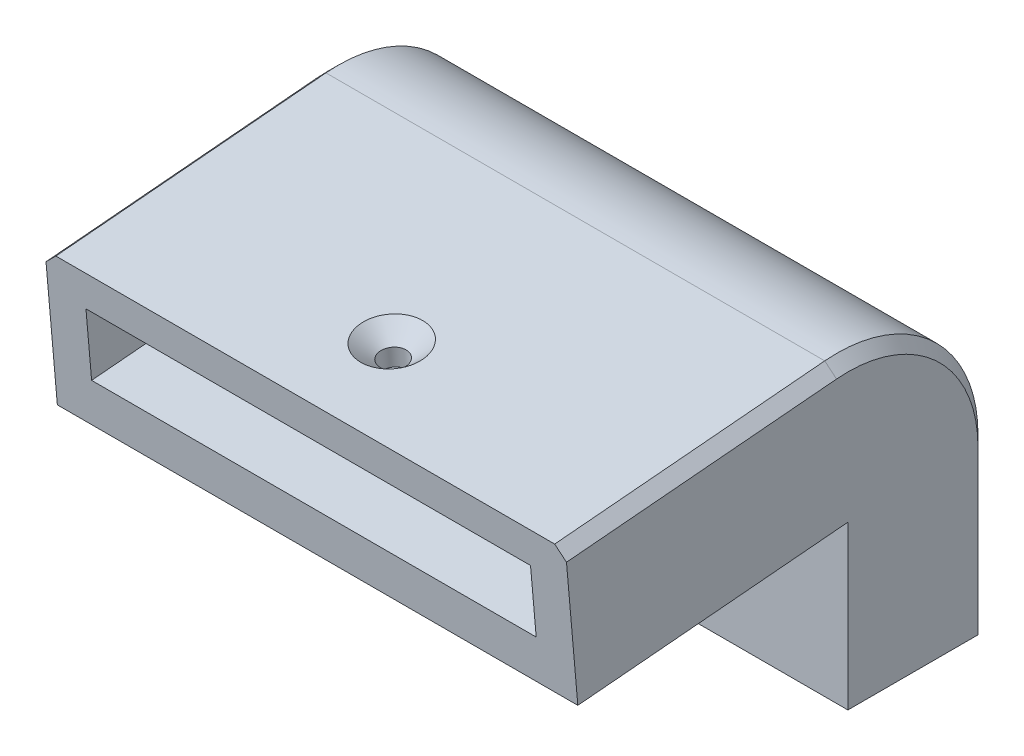
ISO-10303-21;
HEADER;
FILE_DESCRIPTION(('STEP AP214'),'2;1');
FILE_NAME('part.step','',(''),(''),'','','');
FILE_SCHEMA(('AUTOMOTIVE_DESIGN { 1 0 10303 214 1 1 1 1 }'));
ENDSEC;
DATA;
#1=APPLICATION_CONTEXT('core data for automotive mechanical design processes');
#2=APPLICATION_PROTOCOL_DEFINITION('international standard','automotive_design',2000,#1);
#3=PRODUCT_CONTEXT('',#1,'mechanical');
#4=PRODUCT('Part','Part','',(#3));
#5=PRODUCT_RELATED_PRODUCT_CATEGORY('part','',(#4));
#6=PRODUCT_DEFINITION_FORMATION('','',#4);
#7=PRODUCT_DEFINITION_CONTEXT('part definition',#1,'design');
#8=PRODUCT_DEFINITION('design','',#6,#7);
#9=PRODUCT_DEFINITION_SHAPE('','',#8);
#10=(LENGTH_UNIT() NAMED_UNIT(*) SI_UNIT(.MILLI.,.METRE.));
#11=(NAMED_UNIT(*) PLANE_ANGLE_UNIT() SI_UNIT($,.RADIAN.));
#12=(NAMED_UNIT(*) SI_UNIT($,.STERADIAN.) SOLID_ANGLE_UNIT());
#13=UNCERTAINTY_MEASURE_WITH_UNIT(LENGTH_MEASURE(1.E-05),#10,'distance_accuracy_value','');
#14=(GEOMETRIC_REPRESENTATION_CONTEXT(3) GLOBAL_UNCERTAINTY_ASSIGNED_CONTEXT((#13)) GLOBAL_UNIT_ASSIGNED_CONTEXT((#10,
#11,#12)) REPRESENTATION_CONTEXT('',''));
#15=CARTESIAN_POINT('',(0.,0.,0.));
#16=DIRECTION('',(0.,0.,1.));
#17=DIRECTION('',(1.,0.,0.));
#18=AXIS2_PLACEMENT_3D('',#15,#16,#17);
#19=CARTESIAN_POINT('',(0.,0.,0.));
#20=DIRECTION('',(0.,1.,0.));
#21=DIRECTION('',(0.,0.,1.));
#22=AXIS2_PLACEMENT_3D('',#19,#20,#21);
#23=PLANE('',#22);
#24=DIRECTION('',(0.,0.,1.));
#25=VECTOR('',#24,1.);
#26=CARTESIAN_POINT('',(26.035,0.,-3.81));
#27=LINE('',#26,#25);
#28=CARTESIAN_POINT('',(26.035,0.,-3.81));
#29=VERTEX_POINT('',#28);
#30=CARTESIAN_POINT('',(26.035,0.,3.81));
#31=VERTEX_POINT('',#30);
#32=EDGE_CURVE('E199',#29,#31,#27,.T.);
#33=ORIENTED_EDGE('',*,*,#32,.F.);
#34=DIRECTION('',(1.,0.,0.));
#35=VECTOR('',#34,1.);
#36=CARTESIAN_POINT('',(-26.035,0.,-3.81));
#37=LINE('',#36,#35);
#38=CARTESIAN_POINT('',(-26.035,0.,-3.81));
#39=VERTEX_POINT('',#38);
#40=EDGE_CURVE('E173',#39,#29,#37,.T.);
#41=ORIENTED_EDGE('',*,*,#40,.F.);
#42=DIRECTION('',(0.,0.,-1.));
#43=VECTOR('',#42,1.);
#44=CARTESIAN_POINT('',(-26.035,0.,3.81));
#45=LINE('',#44,#43);
#46=CARTESIAN_POINT('',(-26.035,0.,3.81));
#47=VERTEX_POINT('',#46);
#48=EDGE_CURVE('E190',#47,#39,#45,.T.);
#49=ORIENTED_EDGE('',*,*,#48,.F.);
#50=DIRECTION('',(-1.,0.,0.));
#51=VECTOR('',#50,1.);
#52=CARTESIAN_POINT('',(26.035,0.,3.81));
#53=LINE('',#52,#51);
#54=EDGE_CURVE('E193',#31,#47,#53,.T.);
#55=ORIENTED_EDGE('',*,*,#54,.F.);
#56=EDGE_LOOP('',(#33,#41,#49,#55));
#57=FACE_BOUND('',#56,.T.);
#58=DIRECTION('',(-1.,0.,0.));
#59=VECTOR('',#58,1.);
#60=CARTESIAN_POINT('',(-30.48,0.,-8.255));
#61=LINE('',#60,#59);
#62=CARTESIAN_POINT('',(29.21,0.,-8.25500000000001));
#63=VERTEX_POINT('',#62);
#64=CARTESIAN_POINT('',(-29.21,0.,-8.255));
#65=VERTEX_POINT('',#64);
#66=EDGE_CURVE('E274',#63,#65,#61,.T.);
#67=ORIENTED_EDGE('',*,*,#66,.F.);
#68=DIRECTION('',(-0.707106781186552,0.,-0.707106781186543));
#69=VECTOR('',#68,1.);
#70=CARTESIAN_POINT('',(29.21,0.,-8.255));
#71=LINE('',#70,#69);
#72=CARTESIAN_POINT('',(30.48,0.,-6.985));
#73=VERTEX_POINT('',#72);
#74=EDGE_CURVE('E318',#63,#73,#71,.F.);
#75=ORIENTED_EDGE('',*,*,#74,.T.);
#76=DIRECTION('',(0.,0.,-1.));
#77=VECTOR('',#76,1.);
#78=CARTESIAN_POINT('',(30.48,0.,-8.255));
#79=LINE('',#78,#77);
#80=CARTESIAN_POINT('',(30.48,0.,8.255));
#81=VERTEX_POINT('',#80);
#82=EDGE_CURVE('E281',#81,#73,#79,.T.);
#83=ORIENTED_EDGE('',*,*,#82,.F.);
#84=DIRECTION('',(1.,0.,0.));
#85=VECTOR('',#84,1.);
#86=CARTESIAN_POINT('',(-30.48,0.,8.255));
#87=LINE('',#86,#85);
#88=CARTESIAN_POINT('',(-30.48,0.,8.255));
#89=VERTEX_POINT('',#88);
#90=EDGE_CURVE('E279',#89,#81,#87,.T.);
#91=ORIENTED_EDGE('',*,*,#90,.F.);
#92=DIRECTION('',(0.,0.,1.));
#93=VECTOR('',#92,1.);
#94=CARTESIAN_POINT('',(-30.48,0.,-8.255));
#95=LINE('',#94,#93);
#96=CARTESIAN_POINT('',(-30.48,0.,-6.985));
#97=VERTEX_POINT('',#96);
#98=EDGE_CURVE('E257',#97,#89,#95,.T.);
#99=ORIENTED_EDGE('',*,*,#98,.F.);
#100=DIRECTION('',(-0.70710678118655,0.,0.707106781186545));
#101=VECTOR('',#100,1.);
#102=CARTESIAN_POINT('',(-30.48,0.,-6.985));
#103=LINE('',#102,#101);
#104=EDGE_CURVE('E316',#97,#65,#103,.F.);
#105=ORIENTED_EDGE('',*,*,#104,.T.);
#106=EDGE_LOOP('',(#67,#75,#83,#91,#99,#105));
#107=FACE_BOUND('',#106,.T.);
#108=ADVANCED_FACE('F33',(#57,#107),#23,.F.);
#109=CARTESIAN_POINT('',(-30.48,19.05,-8.255));
#110=DIRECTION('',(1.,0.,0.));
#111=DIRECTION('',(0.,0.,-1.));
#112=AXIS2_PLACEMENT_3D('',#109,#110,#111);
#113=PLANE('',#112);
#114=CARTESIAN_POINT('',(-30.48,19.05,8.255));
#115=DIRECTION('',(1.,0.,0.));
#116=DIRECTION('',(0.,0.,-1.));
#117=AXIS2_PLACEMENT_3D('',#114,#115,#116);
#118=CIRCLE('',#117,15.2400000000001);
#119=CARTESIAN_POINT('',(-30.48,34.2320071989183,9.5832535194743));
#120=VERTEX_POINT('',#119);
#121=CARTESIAN_POINT('',(-30.48,19.05,-6.98500000000006));
#122=VERTEX_POINT('',#121);
#123=EDGE_CURVE('E42',#120,#122,#118,.F.);
#124=ORIENTED_EDGE('',*,*,#123,.T.);
#125=DIRECTION('',(0.,-1.,0.));
#126=VECTOR('',#125,1.);
#127=CARTESIAN_POINT('',(-30.48,19.05,-6.985));
#128=LINE('',#127,#126);
#129=EDGE_CURVE('E11',#122,#97,#128,.T.);
#130=ORIENTED_EDGE('',*,*,#129,.T.);
#131=ORIENTED_EDGE('',*,*,#98,.T.);
#132=DIRECTION('',(0.,-1.,0.));
#133=VECTOR('',#132,1.);
#134=CARTESIAN_POINT('',(-30.48,19.05,8.255));
#135=LINE('',#134,#133);
#136=CARTESIAN_POINT('',(-30.48,19.05,8.255));
#137=VERTEX_POINT('',#136);
#138=EDGE_CURVE('E288',#137,#89,#135,.T.);
#139=ORIENTED_EDGE('',*,*,#138,.F.);
#140=DIRECTION('',(0.,-0.0871557427476533,0.996194698091746));
#141=VECTOR('',#140,1.);
#142=CARTESIAN_POINT('',(-30.48,19.05,8.255));
#143=LINE('',#142,#141);
#144=CARTESIAN_POINT('',(-30.48,16.282805167762,39.884181664413));
#145=VERTEX_POINT('',#144);
#146=EDGE_CURVE('E254',#137,#145,#143,.T.);
#147=ORIENTED_EDGE('',*,*,#146,.T.);
#148=DIRECTION('',(0.,0.996194698091746,0.0871557427476573));
#149=VECTOR('',#148,1.);
#150=CARTESIAN_POINT('',(-30.48,16.282805167762,39.884181664413));
#151=LINE('',#150,#149);
#152=CARTESIAN_POINT('',(-30.48,31.4648123666803,41.2124351838873));
#153=VERTEX_POINT('',#152);
#154=EDGE_CURVE('E252',#145,#153,#151,.T.);
#155=ORIENTED_EDGE('',*,*,#154,.T.);
#156=DIRECTION('',(0.,0.0871557427476548,-0.996194698091746));
#157=VECTOR('',#156,1.);
#158=CARTESIAN_POINT('',(-30.48,34.2320071989183,9.5832535194743));
#159=LINE('',#158,#157);
#160=EDGE_CURVE('E53',#153,#120,#159,.T.);
#161=ORIENTED_EDGE('',*,*,#160,.T.);
#162=EDGE_LOOP('',(#124,#130,#131,#139,#147,#155,#161));
#163=FACE_BOUND('',#162,.T.);
#164=ADVANCED_FACE('F398',(#163),#113,.F.);
#165=CARTESIAN_POINT('',(-30.48,19.05,8.255));
#166=DIRECTION('',(0.,0.,-1.));
#167=DIRECTION('',(-1.,0.,0.));
#168=AXIS2_PLACEMENT_3D('',#165,#166,#167);
#169=PLANE('',#168);
#170=CARTESIAN_POINT('',(0.,10.16,8.255));
#171=DIRECTION('',(0.,0.,-1.));
#172=DIRECTION('',(-1.,0.,0.));
#173=AXIS2_PLACEMENT_3D('',#170,#171,#172);
#174=CIRCLE('',#173,1.59389710477452);
#175=CARTESIAN_POINT('',(-1.59389710477452,10.16,8.255));
#176=VERTEX_POINT('',#175);
#177=EDGE_CURVE('E244',#176,#176,#174,.T.);
#178=ORIENTED_EDGE('',*,*,#177,.T.);
#179=EDGE_LOOP('',(#178));
#180=FACE_BOUND('',#179,.T.);
#181=ORIENTED_EDGE('',*,*,#90,.T.);
#182=DIRECTION('',(0.,-1.,0.));
#183=VECTOR('',#182,1.);
#184=CARTESIAN_POINT('',(30.48,19.05,8.255));
#185=LINE('',#184,#183);
#186=CARTESIAN_POINT('',(30.48,19.05,8.255));
#187=VERTEX_POINT('',#186);
#188=EDGE_CURVE('E277',#187,#81,#185,.T.);
#189=ORIENTED_EDGE('',*,*,#188,.F.);
#190=DIRECTION('',(1.,0.,0.));
#191=VECTOR('',#190,1.);
#192=CARTESIAN_POINT('',(-30.48,19.05,8.255));
#193=LINE('',#192,#191);
#194=EDGE_CURVE('E270',#137,#187,#193,.T.);
#195=ORIENTED_EDGE('',*,*,#194,.F.);
#196=ORIENTED_EDGE('',*,*,#138,.T.);
#197=EDGE_LOOP('',(#181,#189,#195,#196));
#198=FACE_BOUND('',#197,.T.);
#199=ADVANCED_FACE('F392',(#180,#198),#169,.F.);
#200=CARTESIAN_POINT('',(30.48,19.05,-8.255));
#201=DIRECTION('',(-1.,0.,0.));
#202=DIRECTION('',(0.,0.,1.));
#203=AXIS2_PLACEMENT_3D('',#200,#201,#202);
#204=PLANE('',#203);
#205=ORIENTED_EDGE('',*,*,#82,.T.);
#206=DIRECTION('',(0.,1.,0.));
#207=VECTOR('',#206,1.);
#208=CARTESIAN_POINT('',(30.48,19.05,-6.985));
#209=LINE('',#208,#207);
#210=CARTESIAN_POINT('',(30.48,19.05,-6.98500000000007));
#211=VERTEX_POINT('',#210);
#212=EDGE_CURVE('E324',#73,#211,#209,.T.);
#213=ORIENTED_EDGE('',*,*,#212,.T.);
#214=CARTESIAN_POINT('',(30.48,19.05,8.255));
#215=DIRECTION('',(-1.,0.,0.));
#216=DIRECTION('',(0.,0.,1.));
#217=AXIS2_PLACEMENT_3D('',#214,#215,#216);
#218=CIRCLE('',#217,15.2400000000001);
#219=CARTESIAN_POINT('',(30.48,34.2320071989183,9.5832535194743));
#220=VERTEX_POINT('',#219);
#221=EDGE_CURVE('E322',#211,#220,#218,.F.);
#222=ORIENTED_EDGE('',*,*,#221,.T.);
#223=DIRECTION('',(0.,-0.0871557427476548,0.996194698091746));
#224=VECTOR('',#223,1.);
#225=CARTESIAN_POINT('',(30.48,31.4648123666803,41.2124351838873));
#226=LINE('',#225,#224);
#227=CARTESIAN_POINT('',(30.48,31.4648123666803,41.2124351838873));
#228=VERTEX_POINT('',#227);
#229=EDGE_CURVE('E320',#220,#228,#226,.T.);
#230=ORIENTED_EDGE('',*,*,#229,.T.);
#231=DIRECTION('',(0.,-0.996194698091746,-0.0871557427476573));
#232=VECTOR('',#231,1.);
#233=CARTESIAN_POINT('',(30.48,16.282805167762,39.884181664413));
#234=LINE('',#233,#232);
#235=CARTESIAN_POINT('',(30.48,16.282805167762,39.884181664413));
#236=VERTEX_POINT('',#235);
#237=EDGE_CURVE('E251',#228,#236,#234,.T.);
#238=ORIENTED_EDGE('',*,*,#237,.T.);
#239=DIRECTION('',(0.,0.0871557427476533,-0.996194698091746));
#240=VECTOR('',#239,1.);
#241=CARTESIAN_POINT('',(30.48,19.05,8.255));
#242=LINE('',#241,#240);
#243=EDGE_CURVE('E259',#236,#187,#242,.T.);
#244=ORIENTED_EDGE('',*,*,#243,.T.);
#245=ORIENTED_EDGE('',*,*,#188,.T.);
#246=EDGE_LOOP('',(#205,#213,#222,#230,#238,#244,#245));
#247=FACE_BOUND('',#246,.T.);
#248=ADVANCED_FACE('F389',(#247),#204,.F.);
#249=CARTESIAN_POINT('',(-30.48,19.05,-8.255));
#250=DIRECTION('',(0.,0.,1.));
#251=DIRECTION('',(1.,0.,0.));
#252=AXIS2_PLACEMENT_3D('',#249,#250,#251);
#253=PLANE('',#252);
#254=CARTESIAN_POINT('',(0.,10.16,-8.255));
#255=DIRECTION('',(0.,0.,1.));
#256=DIRECTION('',(1.,0.,0.));
#257=AXIS2_PLACEMENT_3D('',#254,#255,#256);
#258=CIRCLE('',#257,3.7020971047745);
#259=CARTESIAN_POINT('',(3.7020971047745,10.16,-8.255));
#260=VERTEX_POINT('',#259);
#261=EDGE_CURVE('E294',#260,#260,#258,.T.);
#262=ORIENTED_EDGE('',*,*,#261,.T.);
#263=EDGE_LOOP('',(#262));
#264=FACE_BOUND('',#263,.T.);
#265=DIRECTION('',(-1.,0.,0.));
#266=VECTOR('',#265,1.);
#267=CARTESIAN_POINT('',(-30.48,19.05,-8.255));
#268=LINE('',#267,#266);
#269=CARTESIAN_POINT('',(29.21,19.05,-8.255));
#270=VERTEX_POINT('',#269);
#271=CARTESIAN_POINT('',(-29.21,19.05,-8.255));
#272=VERTEX_POINT('',#271);
#273=EDGE_CURVE('E273',#270,#272,#268,.T.);
#274=ORIENTED_EDGE('',*,*,#273,.F.);
#275=DIRECTION('',(0.,-1.,0.));
#276=VECTOR('',#275,1.);
#277=CARTESIAN_POINT('',(29.21,19.05,-8.255));
#278=LINE('',#277,#276);
#279=EDGE_CURVE('E313',#270,#63,#278,.T.);
#280=ORIENTED_EDGE('',*,*,#279,.T.);
#281=ORIENTED_EDGE('',*,*,#66,.T.);
#282=DIRECTION('',(0.,1.,0.));
#283=VECTOR('',#282,1.);
#284=CARTESIAN_POINT('',(-29.21,19.05,-8.255));
#285=LINE('',#284,#283);
#286=EDGE_CURVE('E303',#65,#272,#285,.T.);
#287=ORIENTED_EDGE('',*,*,#286,.T.);
#288=EDGE_LOOP('',(#274,#280,#281,#287));
#289=FACE_BOUND('',#288,.T.);
#290=ADVANCED_FACE('F376',(#264,#289),#253,.F.);
#291=CARTESIAN_POINT('',(-83.6739894963721,19.05,8.255));
#292=DIRECTION('',(1.,0.,0.));
#293=DIRECTION('',(0.,0.,-1.));
#294=AXIS2_PLACEMENT_3D('',#291,#292,#293);
#295=CYLINDRICAL_SURFACE('',#294,16.5100000000001);
#296=DIRECTION('',(1.,0.,0.));
#297=VECTOR('',#296,1.);
#298=CARTESIAN_POINT('',(-83.6739894963721,35.4971744654949,9.69394131276383));
#299=LINE('',#298,#297);
#300=CARTESIAN_POINT('',(-29.21,35.4971744654949,9.69394131276383));
#301=VERTEX_POINT('',#300);
#302=CARTESIAN_POINT('',(29.21,35.4971744654949,9.69394131276383));
#303=VERTEX_POINT('',#302);
#304=EDGE_CURVE('E262',#301,#303,#299,.T.);
#305=ORIENTED_EDGE('',*,*,#304,.T.);
#306=CARTESIAN_POINT('',(29.21,19.05,8.255));
#307=DIRECTION('',(-1.,0.,0.));
#308=DIRECTION('',(0.,0.,1.));
#309=AXIS2_PLACEMENT_3D('',#306,#307,#308);
#310=CIRCLE('',#309,16.5100000000001);
#311=EDGE_CURVE('E328',#303,#270,#310,.T.);
#312=ORIENTED_EDGE('',*,*,#311,.T.);
#313=ORIENTED_EDGE('',*,*,#273,.T.);
#314=CARTESIAN_POINT('',(-29.21,19.05,8.255));
#315=DIRECTION('',(1.,0.,0.));
#316=DIRECTION('',(0.,0.,-1.));
#317=AXIS2_PLACEMENT_3D('',#314,#315,#316);
#318=CIRCLE('',#317,16.5100000000001);
#319=EDGE_CURVE('E326',#272,#301,#318,.T.);
#320=ORIENTED_EDGE('',*,*,#319,.T.);
#321=EDGE_LOOP('',(#305,#312,#313,#320));
#322=FACE_BOUND('',#321,.T.);
#323=ADVANCED_FACE('F372',(#322),#295,.T.);
#324=CARTESIAN_POINT('',(-83.6739894963721,19.05,8.255));
#325=DIRECTION('',(0.,-0.996194698091746,-0.0871557427476533));
#326=DIRECTION('',(0.,0.0871557427476533,-0.996194698091746));
#327=AXIS2_PLACEMENT_3D('',#324,#325,#326);
#328=PLANE('',#327);
#329=CARTESIAN_POINT('',(0.,17.1683075140782,29.7628435318009));
#330=DIRECTION('',(0.,-0.996194698091746,-0.0871557427476533));
#331=DIRECTION('',(0.,0.0871557427476533,-0.996194698091746));
#332=AXIS2_PLACEMENT_3D('',#329,#330,#331);
#333=CIRCLE('',#332,1.524);
#334=CARTESIAN_POINT('',(0.,17.3011328660256,28.2446428119091));
#335=VERTEX_POINT('',#334);
#336=EDGE_CURVE('E247',#335,#335,#333,.T.);
#337=ORIENTED_EDGE('',*,*,#336,.F.);
#338=EDGE_LOOP('',(#337));
#339=FACE_BOUND('',#338,.T.);
#340=ORIENTED_EDGE('',*,*,#146,.F.);
#341=ORIENTED_EDGE('',*,*,#194,.T.);
#342=ORIENTED_EDGE('',*,*,#243,.F.);
#343=DIRECTION('',(1.,0.,0.));
#344=VECTOR('',#343,1.);
#345=CARTESIAN_POINT('',(-83.6739894963721,16.282805167762,39.884181664413));
#346=LINE('',#345,#344);
#347=EDGE_CURVE('E255',#145,#236,#346,.T.);
#348=ORIENTED_EDGE('',*,*,#347,.F.);
#349=EDGE_LOOP('',(#340,#341,#342,#348));
#350=FACE_BOUND('',#349,.T.);
#351=ADVANCED_FACE('F396',(#339,#350),#328,.T.);
#352=CARTESIAN_POINT('',(-83.6739894963721,16.282805167762,39.884181664413));
#353=DIRECTION('',(0.,-0.0871557427476573,0.996194698091746));
#354=DIRECTION('',(0.,-0.996194698091746,-0.0871557427476573));
#355=AXIS2_PLACEMENT_3D('',#352,#353,#354);
#356=PLANE('',#355);
#357=DIRECTION('',(1.,0.,0.));
#358=VECTOR('',#357,1.);
#359=CARTESIAN_POINT('',(-26.035,21.2060728315969,40.3149117725023));
#360=LINE('',#359,#358);
#361=CARTESIAN_POINT('',(-26.035,21.2060728315969,40.3149117725023));
#362=VERTEX_POINT('',#361);
#363=CARTESIAN_POINT('',(26.035,21.2060728315969,40.3149117725023));
#364=VERTEX_POINT('',#363);
#365=EDGE_CURVE('E224',#362,#364,#360,.T.);
#366=ORIENTED_EDGE('',*,*,#365,.F.);
#367=DIRECTION('',(0.,-0.996194698091746,-0.0871557427476575));
#368=VECTOR('',#367,1.);
#369=CARTESIAN_POINT('',(-26.035,28.797076431056,40.9790385322395));
#370=LINE('',#369,#368);
#371=CARTESIAN_POINT('',(-26.035,28.797076431056,40.9790385322395));
#372=VERTEX_POINT('',#371);
#373=EDGE_CURVE('E214',#372,#362,#370,.T.);
#374=ORIENTED_EDGE('',*,*,#373,.F.);
#375=DIRECTION('',(-1.,0.,0.));
#376=VECTOR('',#375,1.);
#377=CARTESIAN_POINT('',(26.035,28.797076431056,40.9790385322395));
#378=LINE('',#377,#376);
#379=CARTESIAN_POINT('',(26.035,28.797076431056,40.9790385322395));
#380=VERTEX_POINT('',#379);
#381=EDGE_CURVE('E230',#380,#372,#378,.T.);
#382=ORIENTED_EDGE('',*,*,#381,.F.);
#383=DIRECTION('',(0.,0.996194698091746,0.0871557427476575));
#384=VECTOR('',#383,1.);
#385=CARTESIAN_POINT('',(26.035,21.2060728315969,40.3149117725023));
#386=LINE('',#385,#384);
#387=EDGE_CURVE('E226',#364,#380,#386,.T.);
#388=ORIENTED_EDGE('',*,*,#387,.F.);
#389=EDGE_LOOP('',(#366,#374,#382,#388));
#390=FACE_BOUND('',#389,.T.);
#391=ORIENTED_EDGE('',*,*,#237,.F.);
#392=DIRECTION('',(-0.707106781186552,0.704416026402754,0.0616284167162183));
#393=VECTOR('',#392,1.);
#394=CARTESIAN_POINT('',(-18.9769947481868,80.7336083183746,45.5228962952325));
#395=LINE('',#394,#393);
#396=CARTESIAN_POINT('',(29.21,32.7299796332568,41.3231229771769));
#397=VERTEX_POINT('',#396);
#398=EDGE_CURVE('E332',#228,#397,#395,.T.);
#399=ORIENTED_EDGE('',*,*,#398,.T.);
#400=DIRECTION('',(1.,0.,0.));
#401=VECTOR('',#400,1.);
#402=CARTESIAN_POINT('',(-83.6739894963721,32.7299796332568,41.3231229771769));
#403=LINE('',#402,#401);
#404=CARTESIAN_POINT('',(-29.21,32.7299796332568,41.3231229771769));
#405=VERTEX_POINT('',#404);
#406=EDGE_CURVE('E265',#405,#397,#403,.T.);
#407=ORIENTED_EDGE('',*,*,#406,.F.);
#408=DIRECTION('',(-0.70710678118655,-0.704416026402756,-0.0616284167162185));
#409=VECTOR('',#408,1.);
#410=CARTESIAN_POINT('',(-64.6969947481863,-2.62197638609574,38.2302275920165));
#411=LINE('',#410,#409);
#412=EDGE_CURVE('E330',#405,#153,#411,.T.);
#413=ORIENTED_EDGE('',*,*,#412,.T.);
#414=ORIENTED_EDGE('',*,*,#154,.F.);
#415=ORIENTED_EDGE('',*,*,#347,.T.);
#416=EDGE_LOOP('',(#391,#399,#407,#413,#414,#415));
#417=FACE_BOUND('',#416,.T.);
#418=ADVANCED_FACE('F363',(#390,#417),#356,.T.);
#419=CARTESIAN_POINT('',(-83.6739894963721,33.836857566152,28.6714503114117));
#420=DIRECTION('',(0.,0.996194698091746,0.0871557427476548));
#421=DIRECTION('',(0.,-0.0871557427476548,0.996194698091746));
#422=AXIS2_PLACEMENT_3D('',#419,#420,#421);
#423=PLANE('',#422);
#424=CARTESIAN_POINT('',(0.,33.615481979573,31.2017848445647));
#425=DIRECTION('',(0.,0.996194698091746,0.0871557427476548));
#426=DIRECTION('',(0.,-0.0871557427476548,0.996194698091746));
#427=AXIS2_PLACEMENT_3D('',#424,#425,#426);
#428=CIRCLE('',#427,3.63219999999995);
#429=CARTESIAN_POINT('',(0.,33.2989148907649,34.8201632269735));
#430=VERTEX_POINT('',#429);
#431=EDGE_CURVE('E300',#430,#430,#428,.F.);
#432=ORIENTED_EDGE('',*,*,#431,.T.);
#433=EDGE_LOOP('',(#432));
#434=FACE_BOUND('',#433,.T.);
#435=ORIENTED_EDGE('',*,*,#406,.T.);
#436=DIRECTION('',(0.,0.0871557427476548,-0.996194698091746));
#437=VECTOR('',#436,1.);
#438=CARTESIAN_POINT('',(29.21,35.4971744654948,9.69394131276383));
#439=LINE('',#438,#437);
#440=EDGE_CURVE('E336',#397,#303,#439,.T.);
#441=ORIENTED_EDGE('',*,*,#440,.T.);
#442=ORIENTED_EDGE('',*,*,#304,.F.);
#443=DIRECTION('',(0.,-0.0871557427476548,0.996194698091746));
#444=VECTOR('',#443,1.);
#445=CARTESIAN_POINT('',(-29.21,32.7299796332568,41.3231229771769));
#446=LINE('',#445,#444);
#447=EDGE_CURVE('E334',#301,#405,#446,.T.);
#448=ORIENTED_EDGE('',*,*,#447,.T.);
#449=EDGE_LOOP('',(#435,#441,#442,#448));
#450=FACE_BOUND('',#449,.T.);
#451=ADVANCED_FACE('F359',(#434,#450),#423,.T.);
#452=CARTESIAN_POINT('',(0.,-3.17045204000364,27.9834326406393));
#453=DIRECTION('',(0.,0.996194698091746,0.0871557427476549));
#454=DIRECTION('',(0.,-0.0871557427476548,0.996194698091746));
#455=AXIS2_PLACEMENT_3D('',#452,#453,#454);
#456=CYLINDRICAL_SURFACE('',#455,1.524);
#457=CARTESIAN_POINT('',(0.,29.6825787773722,30.8577003996274));
#458=DIRECTION('',(0.,0.996194698091746,0.0871557427476573));
#459=DIRECTION('',(0.,-0.0871557427476573,0.996194698091746));
#460=AXIS2_PLACEMENT_3D('',#457,#458,#459);
#461=CIRCLE('',#460,1.524);
#462=CARTESIAN_POINT('',(0.,29.5497534254248,32.3759011195192));
#463=VERTEX_POINT('',#462);
#464=EDGE_CURVE('E248',#463,#463,#461,.F.);
#465=ORIENTED_EDGE('',*,*,#464,.T.);
#466=EDGE_LOOP('',(#465));
#467=FACE_BOUND('',#466,.T.);
#468=CARTESIAN_POINT('',(0.,31.7898253904891,31.0420605895285));
#469=DIRECTION('',(0.,0.996194698091746,0.0871557427476546));
#470=DIRECTION('',(0.,-0.0871557427476547,0.996194698091746));
#471=AXIS2_PLACEMENT_3D('',#468,#469,#470);
#472=CIRCLE('',#471,1.524);
#473=CARTESIAN_POINT('',(0.,31.6570000385417,32.5602613094203));
#474=VERTEX_POINT('',#473);
#475=EDGE_CURVE('E297',#474,#474,#472,.T.);
#476=ORIENTED_EDGE('',*,*,#475,.T.);
#477=EDGE_LOOP('',(#476));
#478=FACE_BOUND('',#477,.T.);
#479=ADVANCED_FACE('F458',(#467,#478),#456,.F.);
#480=CARTESIAN_POINT('',(0.,22.0915751779131,30.1935736398902));
#481=DIRECTION('',(0.,-0.996194698091746,-0.0871557427476573));
#482=DIRECTION('',(0.,0.0871557427476573,-0.996194698091746));
#483=AXIS2_PLACEMENT_3D('',#480,#481,#482);
#484=CIRCLE('',#483,1.524);
#485=CARTESIAN_POINT('',(0.,22.2244005298605,28.6753729199984));
#486=VERTEX_POINT('',#485);
#487=EDGE_CURVE('E237',#486,#486,#484,.F.);
#488=ORIENTED_EDGE('',*,*,#487,.T.);
#489=EDGE_LOOP('',(#488));
#490=FACE_BOUND('',#489,.T.);
#491=ORIENTED_EDGE('',*,*,#336,.T.);
#492=EDGE_LOOP('',(#491));
#493=FACE_BOUND('',#492,.T.);
#494=ADVANCED_FACE('F463',(#490,#493),#456,.F.);
#495=CARTESIAN_POINT('',(0.,10.16,41.3231229771769));
#496=DIRECTION('',(0.,0.,-1.));
#497=DIRECTION('',(-1.,0.,0.));
#498=AXIS2_PLACEMENT_3D('',#495,#496,#497);
#499=CYLINDRICAL_SURFACE('',#498,1.59389710477452);
#500=CARTESIAN_POINT('',(0.,10.16,3.81));
#501=DIRECTION('',(0.,0.,1.));
#502=DIRECTION('',(1.,0.,0.));
#503=AXIS2_PLACEMENT_3D('',#500,#501,#502);
#504=CIRCLE('',#503,1.59389710477452);
#505=CARTESIAN_POINT('',(-1.59389710477452,10.16,3.80999999999999));
#506=VERTEX_POINT('',#505);
#507=EDGE_CURVE('E227',#506,#506,#504,.F.);
#508=CARTESIAN_POINT('',(-1.59389710477452,10.16,3.80999999999999));
#509=CARTESIAN_POINT('',(-1.59389710477452,10.16,3.85630208333333));
#510=CARTESIAN_POINT('',(-1.59389710477452,10.16,3.90260416666666));
#511=CARTESIAN_POINT('',(-1.59389710477452,10.16,3.99520833333333));
#512=CARTESIAN_POINT('',(-1.59389710477452,10.16,4.04151041666666));
#513=CARTESIAN_POINT('',(-1.59389710477452,10.16,4.13411458333333));
#514=CARTESIAN_POINT('',(-1.59389710477452,10.16,4.18041666666666));
#515=CARTESIAN_POINT('',(-1.59389710477452,10.16,4.27302083333333));
#516=CARTESIAN_POINT('',(-1.59389710477452,10.16,4.31932291666666));
#517=CARTESIAN_POINT('',(-1.59389710477452,10.16,4.41192708333333));
#518=CARTESIAN_POINT('',(-1.59389710477452,10.16,4.45822916666666));
#519=CARTESIAN_POINT('',(-1.59389710477452,10.16,4.55083333333333));
#520=CARTESIAN_POINT('',(-1.59389710477452,10.16,4.59713541666666));
#521=CARTESIAN_POINT('',(-1.59389710477452,10.16,4.68973958333333));
#522=CARTESIAN_POINT('',(-1.59389710477452,10.16,4.73604166666666));
#523=CARTESIAN_POINT('',(-1.59389710477452,10.16,4.82864583333333));
#524=CARTESIAN_POINT('',(-1.59389710477452,10.16,4.87494791666666));
#525=CARTESIAN_POINT('',(-1.59389710477452,10.16,4.96755208333333));
#526=CARTESIAN_POINT('',(-1.59389710477452,10.16,5.01385416666666));
#527=CARTESIAN_POINT('',(-1.59389710477452,10.16,5.10645833333333));
#528=CARTESIAN_POINT('',(-1.59389710477452,10.16,5.15276041666666));
#529=CARTESIAN_POINT('',(-1.59389710477452,10.16,5.24536458333333));
#530=CARTESIAN_POINT('',(-1.59389710477452,10.16,5.29166666666666));
#531=CARTESIAN_POINT('',(-1.59389710477452,10.16,5.38427083333333));
#532=CARTESIAN_POINT('',(-1.59389710477452,10.16,5.43057291666666));
#533=CARTESIAN_POINT('',(-1.59389710477452,10.16,5.52317708333333));
#534=CARTESIAN_POINT('',(-1.59389710477452,10.16,5.56947916666666));
#535=CARTESIAN_POINT('',(-1.59389710477452,10.16,5.66208333333333));
#536=CARTESIAN_POINT('',(-1.59389710477452,10.16,5.70838541666666));
#537=CARTESIAN_POINT('',(-1.59389710477452,10.16,5.80098958333333));
#538=CARTESIAN_POINT('',(-1.59389710477452,10.16,5.84729166666666));
#539=CARTESIAN_POINT('',(-1.59389710477452,10.16,5.93989583333333));
#540=CARTESIAN_POINT('',(-1.59389710477452,10.16,5.98619791666666));
#541=CARTESIAN_POINT('',(-1.59389710477452,10.16,6.07880208333333));
#542=CARTESIAN_POINT('',(-1.59389710477452,10.16,6.12510416666666));
#543=CARTESIAN_POINT('',(-1.59389710477452,10.16,6.21770833333333));
#544=CARTESIAN_POINT('',(-1.59389710477452,10.16,6.26401041666666));
#545=CARTESIAN_POINT('',(-1.59389710477452,10.16,6.35661458333333));
#546=CARTESIAN_POINT('',(-1.59389710477452,10.16,6.40291666666667));
#547=CARTESIAN_POINT('',(-1.59389710477452,10.16,6.49552083333333));
#548=CARTESIAN_POINT('',(-1.59389710477452,10.16,6.54182291666667));
#549=CARTESIAN_POINT('',(-1.59389710477452,10.16,6.63442708333333));
#550=CARTESIAN_POINT('',(-1.59389710477452,10.16,6.68072916666666));
#551=CARTESIAN_POINT('',(-1.59389710477452,10.16,6.77333333333333));
#552=CARTESIAN_POINT('',(-1.59389710477452,10.16,6.81963541666666));
#553=CARTESIAN_POINT('',(-1.59389710477452,10.16,6.91223958333333));
#554=CARTESIAN_POINT('',(-1.59389710477452,10.16,6.95854166666666));
#555=CARTESIAN_POINT('',(-1.59389710477452,10.16,7.05114583333333));
#556=CARTESIAN_POINT('',(-1.59389710477452,10.16,7.09744791666666));
#557=CARTESIAN_POINT('',(-1.59389710477452,10.16,7.19005208333333));
#558=CARTESIAN_POINT('',(-1.59389710477452,10.16,7.23635416666666));
#559=CARTESIAN_POINT('',(-1.59389710477452,10.16,7.32895833333333));
#560=CARTESIAN_POINT('',(-1.59389710477452,10.16,7.37526041666667));
#561=CARTESIAN_POINT('',(-1.59389710477452,10.16,7.46786458333333));
#562=CARTESIAN_POINT('',(-1.59389710477452,10.16,7.51416666666667));
#563=CARTESIAN_POINT('',(-1.59389710477452,10.16,7.60677083333333));
#564=CARTESIAN_POINT('',(-1.59389710477452,10.16,7.65307291666666));
#565=CARTESIAN_POINT('',(-1.59389710477452,10.16,7.74567708333333));
#566=CARTESIAN_POINT('',(-1.59389710477452,10.16,7.79197916666666));
#567=CARTESIAN_POINT('',(-1.59389710477452,10.16,7.88458333333333));
#568=CARTESIAN_POINT('',(-1.59389710477452,10.16,7.93088541666666));
#569=CARTESIAN_POINT('',(-1.59389710477452,10.16,8.02348958333333));
#570=CARTESIAN_POINT('',(-1.59389710477452,10.16,8.06979166666666));
#571=CARTESIAN_POINT('',(-1.59389710477452,10.16,8.16239583333333));
#572=CARTESIAN_POINT('',(-1.59389710477452,10.16,8.20869791666667));
#573=CARTESIAN_POINT('',(-1.59389710477452,10.16,8.255));
#574=B_SPLINE_CURVE_WITH_KNOTS('',3,(#508,#509,#510,#511,#512,#513,#514,#515,#516,#517,#518,
#519,#520,#521,#522,#523,#524,#525,#526,#527,#528,#529,#530,#531,#532,#533,#534,#535,#536,#537,
#538,#539,#540,#541,#542,#543,#544,#545,#546,#547,#548,#549,#550,#551,#552,#553,#554,#555,#556,
#557,#558,#559,#560,#561,#562,#563,#564,#565,#566,#567,#568,#569,#570,#571,#572,#573),
.UNSPECIFIED.,.F.,.F.,(4,2,2,2,2,2,2,2,2,2,2,2,2,2,2,2,2,2,2,2,2,2,2,2,2,2,2,2,2,2,2,2,4),(0.,
0.138906250000001,0.277812500000002,0.416718750000003,0.555625000000004,0.694531249999998,
0.833437499999999,0.97234375,1.11125,1.25015625,1.3890625,1.52796875,1.666875,1.80578125,
1.9446875,2.08359375,2.2225,2.36140625,2.5003125,2.63921875000001,2.77812500000001,2.91703125,
3.0559375,3.19484375,3.33375,3.47265625,3.61156250000001,3.75046875000001,3.889375,4.02828125,
4.1671875,4.30609375,4.445),.UNSPECIFIED.);
#575=EDGE_CURVE('BSEAM473',#506,#176,#574,.T.);
#576=ORIENTED_EDGE('',*,*,#507,.T.);
#577=ORIENTED_EDGE('',*,*,#177,.F.);
#578=ORIENTED_EDGE('',*,*,#575,.T.);
#579=ORIENTED_EDGE('',*,*,#575,.F.);
#580=EDGE_LOOP('',(#576,#578,#577,#579));
#581=FACE_BOUND('',#580,.T.);
#582=ADVANCED_FACE('F473',(#581),#499,.F.);
#583=CARTESIAN_POINT('',(0.,10.16,-3.81));
#584=DIRECTION('',(0.,0.,-1.));
#585=DIRECTION('',(-1.,0.,0.));
#586=AXIS2_PLACEMENT_3D('',#583,#584,#585);
#587=CIRCLE('',#586,1.59389710477452);
#588=CARTESIAN_POINT('',(-1.59389710477452,10.16,-3.81));
#589=VERTEX_POINT('',#588);
#590=EDGE_CURVE('E206',#589,#589,#587,.F.);
#591=ORIENTED_EDGE('',*,*,#590,.T.);
#592=EDGE_LOOP('',(#591));
#593=FACE_BOUND('',#592,.T.);
#594=CARTESIAN_POINT('',(0.,10.16,-6.42236969933586));
#595=DIRECTION('',(0.,0.,1.));
#596=DIRECTION('',(1.,0.,0.));
#597=AXIS2_PLACEMENT_3D('',#594,#595,#596);
#598=CIRCLE('',#597,1.59389710477452);
#599=CARTESIAN_POINT('',(1.59389710477452,10.16,-6.42236969933586));
#600=VERTEX_POINT('',#599);
#601=EDGE_CURVE('E291',#600,#600,#598,.F.);
#602=ORIENTED_EDGE('',*,*,#601,.T.);
#603=EDGE_LOOP('',(#602));
#604=FACE_BOUND('',#603,.T.);
#605=ADVANCED_FACE('F430',(#593,#604),#499,.F.);
#606=CARTESIAN_POINT('',(0.,10.16,-6.42236969933586));
#607=DIRECTION('',(0.,0.,-1.));
#608=DIRECTION('',(-1.,0.,0.));
#609=AXIS2_PLACEMENT_3D('',#606,#607,#608);
#610=CONICAL_SURFACE('',#609,1.59389710477452,0.855211333477224);
#611=ORIENTED_EDGE('',*,*,#261,.F.);
#612=EDGE_LOOP('',(#611));
#613=FACE_BOUND('',#612,.T.);
#614=ORIENTED_EDGE('',*,*,#601,.F.);
#615=EDGE_LOOP('',(#614));
#616=FACE_BOUND('',#615,.T.);
#617=ADVANCED_FACE('F426',(#613,#616),#610,.F.);
#618=CARTESIAN_POINT('',(0.,31.7898253904891,31.0420605895285));
#619=DIRECTION('',(0.,0.996194698091746,0.0871557427476546));
#620=DIRECTION('',(0.,-0.0871557427476547,0.996194698091746));
#621=AXIS2_PLACEMENT_3D('',#618,#619,#620);
#622=CONICAL_SURFACE('',#621,1.524,0.855211333477222);
#623=CARTESIAN_POINT('',(0.,33.2989148907649,34.8201632269735));
#624=CARTESIAN_POINT('',(0.,33.2818116110543,34.796622581999));
#625=CARTESIAN_POINT('',(0.,33.2647083313436,34.7730819370245));
#626=CARTESIAN_POINT('',(0.,33.2305017719223,34.7260006470755));
#627=CARTESIAN_POINT('',(0.,33.2133984922116,34.702460002101));
#628=CARTESIAN_POINT('',(0.,33.1791919327903,34.6553787121519));
#629=CARTESIAN_POINT('',(0.,33.1620886530797,34.6318380671774));
#630=CARTESIAN_POINT('',(0.,33.1278820936584,34.5847567772284));
#631=CARTESIAN_POINT('',(0.,33.1107788139477,34.5612161322539));
#632=CARTESIAN_POINT('',(0.,33.0765722545264,34.5141348423049));
#633=CARTESIAN_POINT('',(0.,33.0594689748157,34.4905941973303));
#634=CARTESIAN_POINT('',(0.,33.0252624153944,34.4435129073813));
#635=CARTESIAN_POINT('',(0.,33.0081591356837,34.4199722624068));
#636=CARTESIAN_POINT('',(0.,32.9739525762624,34.3728909724578));
#637=CARTESIAN_POINT('',(0.,32.9568492965518,34.3493503274833));
#638=CARTESIAN_POINT('',(0.,32.9226427371304,34.3022690375342));
#639=CARTESIAN_POINT('',(0.,32.9055394574198,34.2787283925597));
#640=CARTESIAN_POINT('',(0.,32.8713328979985,34.2316471026107));
#641=CARTESIAN_POINT('',(0.,32.8542296182878,34.2081064576362));
#642=CARTESIAN_POINT('',(0.,32.8200230588665,34.1610251676872));
#643=CARTESIAN_POINT('',(0.,32.8029197791558,34.1374845227127));
#644=CARTESIAN_POINT('',(0.,32.7687132197345,34.0904032327636));
#645=CARTESIAN_POINT('',(0.,32.7516099400238,34.0668625877891));
#646=CARTESIAN_POINT('',(0.,32.7174033806025,34.0197812978401));
#647=CARTESIAN_POINT('',(0.,32.7003001008919,33.9962406528656));
#648=CARTESIAN_POINT('',(0.,32.6660935414706,33.9491593629166));
#649=CARTESIAN_POINT('',(0.,32.6489902617599,33.925618717942));
#650=CARTESIAN_POINT('',(0.,32.6147837023386,33.878537427993));
#651=CARTESIAN_POINT('',(0.,32.5976804226279,33.8549967830185));
#652=CARTESIAN_POINT('',(0.,32.5634738632066,33.8079154930695));
#653=CARTESIAN_POINT('',(0.,32.5463705834959,33.784374848095));
#654=CARTESIAN_POINT('',(0.,32.5121640240746,33.7372935581459));
#655=CARTESIAN_POINT('',(0.,32.495060744364,33.7137529131714));
#656=CARTESIAN_POINT('',(0.,32.4608541849426,33.6666716232224));
#657=CARTESIAN_POINT('',(0.,32.443750905232,33.6431309782479));
#658=CARTESIAN_POINT('',(0.,32.4095443458107,33.5960496882989));
#659=CARTESIAN_POINT('',(0.,32.3924410661,33.5725090433244));
#660=CARTESIAN_POINT('',(0.,32.3582345066787,33.5254277533753));
#661=CARTESIAN_POINT('',(0.,32.341131226968,33.5018871084008));
#662=CARTESIAN_POINT('',(0.,32.3069246675467,33.4548058184518));
#663=CARTESIAN_POINT('',(0.,32.289821387836,33.4312651734773));
#664=CARTESIAN_POINT('',(0.,32.2556148284147,33.3841838835283));
#665=CARTESIAN_POINT('',(0.,32.2385115487041,33.3606432385537));
#666=CARTESIAN_POINT('',(0.,32.2043049892828,33.3135619486047));
#667=CARTESIAN_POINT('',(0.,32.1872017095721,33.2900213036302));
#668=CARTESIAN_POINT('',(0.,32.1529951501508,33.2429400136812));
#669=CARTESIAN_POINT('',(0.,32.1358918704401,33.2193993687067));
#670=CARTESIAN_POINT('',(0.,32.1016853110188,33.1723180787576));
#671=CARTESIAN_POINT('',(0.,32.0845820313081,33.1487774337831));
#672=CARTESIAN_POINT('',(0.,32.0503754718868,33.1016961438341));
#673=CARTESIAN_POINT('',(0.,32.0332721921762,33.0781554988596));
#674=CARTESIAN_POINT('',(0.,31.9990656327548,33.0310742089106));
#675=CARTESIAN_POINT('',(0.,31.9819623530442,33.0075335639361));
#676=CARTESIAN_POINT('',(0.,31.9477557936229,32.960452273987));
#677=CARTESIAN_POINT('',(0.,31.9306525139122,32.9369116290125));
#678=CARTESIAN_POINT('',(0.,31.8964459544909,32.8898303390635));
#679=CARTESIAN_POINT('',(0.,31.8793426747802,32.866289694089));
#680=CARTESIAN_POINT('',(0.,31.8451361153589,32.8192084041399));
#681=CARTESIAN_POINT('',(0.,31.8280328356483,32.7956677591654));
#682=CARTESIAN_POINT('',(0.,31.7938262762269,32.7485864692164));
#683=CARTESIAN_POINT('',(0.,31.7767229965163,32.7250458242419));
#684=CARTESIAN_POINT('',(0.,31.7425164370949,32.6779645342929));
#685=CARTESIAN_POINT('',(0.,31.7254131573843,32.6544238893184));
#686=CARTESIAN_POINT('',(0.,31.691206597963,32.6073425993693));
#687=CARTESIAN_POINT('',(0.,31.6741033182523,32.5838019543948));
#688=CARTESIAN_POINT('',(0.,31.6570000385417,32.5602613094203));
#689=B_SPLINE_CURVE_WITH_KNOTS('',3,(#623,#624,#625,#626,#627,#628,#629,#630,#631,#632,#633,
#634,#635,#636,#637,#638,#639,#640,#641,#642,#643,#644,#645,#646,#647,#648,#649,#650,#651,#652,
#653,#654,#655,#656,#657,#658,#659,#660,#661,#662,#663,#664,#665,#666,#667,#668,#669,#670,#671,
#672,#673,#674,#675,#676,#677,#678,#679,#680,#681,#682,#683,#684,#685,#686,#687,#688),
.UNSPECIFIED.,.F.,.F.,(4,2,2,2,2,2,2,2,2,2,2,2,2,2,2,2,2,2,2,2,2,2,2,2,2,2,2,2,2,2,2,2,4),(0.,
0.0872935122680586,0.174587024536121,0.261880536804174,0.349174049072235,0.436467561340298,
0.523761073608357,0.611054585876414,0.698348098144471,0.785641610412534,0.872935122680596,
0.960228634948654,1.04752214721671,1.13481565948477,1.22210917175284,1.30940268402089,
1.39669619628895,1.48398970855701,1.57128322082507,1.65857673309313,1.74587024536119,
1.83316375762924,1.92045726989731,2.00775078216536,2.09504429443342,2.18233780670148,
2.26963131896955,2.3569248312376,2.44421834350566,2.53151185577372,2.61880536804178,
2.70609888030984,2.79339239257789),.UNSPECIFIED.);
#690=EDGE_CURVE('BSEAM429',#430,#474,#689,.T.);
#691=ORIENTED_EDGE('',*,*,#431,.F.);
#692=ORIENTED_EDGE('',*,*,#475,.F.);
#693=ORIENTED_EDGE('',*,*,#690,.T.);
#694=ORIENTED_EDGE('',*,*,#690,.F.);
#695=EDGE_LOOP('',(#691,#693,#692,#694));
#696=FACE_BOUND('',#695,.T.);
#697=ADVANCED_FACE('F429',(#696),#622,.F.);
#698=CARTESIAN_POINT('',(26.035,30.4573933303989,22.0015295335917));
#699=DIRECTION('',(0.,0.996194698091746,0.0871557427476573));
#700=DIRECTION('',(0.,-0.0871557427476573,0.996194698091746));
#701=AXIS2_PLACEMENT_3D('',#698,#699,#700);
#702=PLANE('',#701);
#703=ORIENTED_EDGE('',*,*,#381,.T.);
#704=DIRECTION('',(0.,-0.0871557427476573,0.996194698091746));
#705=VECTOR('',#704,1.);
#706=CARTESIAN_POINT('',(-26.035,30.4573933303989,22.0015295335917));
#707=LINE('',#706,#705);
#708=CARTESIAN_POINT('',(-26.035,30.4573933303989,22.0015295335917));
#709=VERTEX_POINT('',#708);
#710=EDGE_CURVE('E238',#709,#372,#707,.T.);
#711=ORIENTED_EDGE('',*,*,#710,.F.);
#712=DIRECTION('',(-1.,0.,0.));
#713=VECTOR('',#712,1.);
#714=CARTESIAN_POINT('',(26.035,30.4573933303989,22.0015295335917));
#715=LINE('',#714,#713);
#716=CARTESIAN_POINT('',(26.035,30.4573933303989,22.0015295335917));
#717=VERTEX_POINT('',#716);
#718=EDGE_CURVE('E217',#717,#709,#715,.T.);
#719=ORIENTED_EDGE('',*,*,#718,.F.);
#720=DIRECTION('',(0.,-0.0871557427476573,0.996194698091746));
#721=VECTOR('',#720,1.);
#722=CARTESIAN_POINT('',(26.035,30.4573933303989,22.0015295335917));
#723=LINE('',#722,#721);
#724=EDGE_CURVE('E240',#717,#380,#723,.T.);
#725=ORIENTED_EDGE('',*,*,#724,.T.);
#726=EDGE_LOOP('',(#703,#711,#719,#725));
#727=FACE_BOUND('',#726,.T.);
#728=ORIENTED_EDGE('',*,*,#464,.F.);
#729=EDGE_LOOP('',(#728));
#730=FACE_BOUND('',#729,.T.);
#731=ADVANCED_FACE('F434',(#727,#730),#702,.F.);
#732=CARTESIAN_POINT('',(-26.035,22.8663897309398,21.3374027738546));
#733=DIRECTION('',(0.,-0.996194698091746,-0.0871557427476573));
#734=DIRECTION('',(0.,0.0871557427476573,-0.996194698091746));
#735=AXIS2_PLACEMENT_3D('',#732,#733,#734);
#736=PLANE('',#735);
#737=ORIENTED_EDGE('',*,*,#365,.T.);
#738=DIRECTION('',(0.,-0.0871557427476573,0.996194698091746));
#739=VECTOR('',#738,1.);
#740=CARTESIAN_POINT('',(26.035,22.8663897309398,21.3374027738546));
#741=LINE('',#740,#739);
#742=CARTESIAN_POINT('',(26.035,22.8663897309398,21.3374027738546));
#743=VERTEX_POINT('',#742);
#744=EDGE_CURVE('E223',#743,#364,#741,.T.);
#745=ORIENTED_EDGE('',*,*,#744,.F.);
#746=DIRECTION('',(1.,0.,0.));
#747=VECTOR('',#746,1.);
#748=CARTESIAN_POINT('',(-26.035,22.8663897309398,21.3374027738546));
#749=LINE('',#748,#747);
#750=CARTESIAN_POINT('',(-26.035,22.8663897309398,21.3374027738546));
#751=VERTEX_POINT('',#750);
#752=EDGE_CURVE('E210',#751,#743,#749,.T.);
#753=ORIENTED_EDGE('',*,*,#752,.F.);
#754=DIRECTION('',(0.,-0.0871557427476573,0.996194698091746));
#755=VECTOR('',#754,1.);
#756=CARTESIAN_POINT('',(-26.035,22.8663897309398,21.3374027738546));
#757=LINE('',#756,#755);
#758=EDGE_CURVE('E235',#751,#362,#757,.T.);
#759=ORIENTED_EDGE('',*,*,#758,.T.);
#760=EDGE_LOOP('',(#737,#745,#753,#759));
#761=FACE_BOUND('',#760,.T.);
#762=ORIENTED_EDGE('',*,*,#487,.F.);
#763=EDGE_LOOP('',(#762));
#764=FACE_BOUND('',#763,.T.);
#765=ADVANCED_FACE('F479',(#761,#764),#736,.F.);
#766=CARTESIAN_POINT('',(-26.035,30.4573933303989,22.0015295335917));
#767=DIRECTION('',(-1.,0.,0.));
#768=DIRECTION('',(0.,0.,1.));
#769=AXIS2_PLACEMENT_3D('',#766,#767,#768);
#770=PLANE('',#769);
#771=ORIENTED_EDGE('',*,*,#373,.T.);
#772=ORIENTED_EDGE('',*,*,#758,.F.);
#773=DIRECTION('',(0.,-0.996194698091746,-0.0871557427476575));
#774=VECTOR('',#773,1.);
#775=CARTESIAN_POINT('',(-26.035,30.4573933303989,22.0015295335917));
#776=LINE('',#775,#774);
#777=EDGE_CURVE('E220',#709,#751,#776,.T.);
#778=ORIENTED_EDGE('',*,*,#777,.F.);
#779=ORIENTED_EDGE('',*,*,#710,.T.);
#780=EDGE_LOOP('',(#771,#772,#778,#779));
#781=FACE_BOUND('',#780,.T.);
#782=ADVANCED_FACE('F482',(#781),#770,.F.);
#783=CARTESIAN_POINT('',(26.035,22.8663897309398,21.3374027738546));
#784=DIRECTION('',(1.,0.,0.));
#785=DIRECTION('',(0.,1.,0.));
#786=AXIS2_PLACEMENT_3D('',#783,#784,#785);
#787=PLANE('',#786);
#788=ORIENTED_EDGE('',*,*,#387,.T.);
#789=ORIENTED_EDGE('',*,*,#724,.F.);
#790=DIRECTION('',(0.,0.996194698091746,0.0871557427476575));
#791=VECTOR('',#790,1.);
#792=CARTESIAN_POINT('',(26.035,22.8663897309398,21.3374027738546));
#793=LINE('',#792,#791);
#794=EDGE_CURVE('E213',#743,#717,#793,.T.);
#795=ORIENTED_EDGE('',*,*,#794,.F.);
#796=ORIENTED_EDGE('',*,*,#744,.T.);
#797=EDGE_LOOP('',(#788,#789,#795,#796));
#798=FACE_BOUND('',#797,.T.);
#799=ADVANCED_FACE('F484',(#798),#787,.F.);
#800=CARTESIAN_POINT('',(0.,-1.67890463365677,19.1899677740457));
#801=DIRECTION('',(0.,-0.0871557427476567,0.996194698091746));
#802=DIRECTION('',(0.,-0.996194698091746,-0.0871557427476567));
#803=AXIS2_PLACEMENT_3D('',#800,#801,#802);
#804=PLANE('',#803);
#805=ORIENTED_EDGE('',*,*,#752,.T.);
#806=ORIENTED_EDGE('',*,*,#794,.T.);
#807=ORIENTED_EDGE('',*,*,#718,.T.);
#808=ORIENTED_EDGE('',*,*,#777,.T.);
#809=EDGE_LOOP('',(#805,#806,#807,#808));
#810=FACE_BOUND('',#809,.T.);
#811=ADVANCED_FACE('F450',(#810),#804,.T.);
#812=CARTESIAN_POINT('',(26.035,19.05,3.81));
#813=DIRECTION('',(0.,0.,1.));
#814=DIRECTION('',(1.,0.,0.));
#815=AXIS2_PLACEMENT_3D('',#812,#813,#814);
#816=PLANE('',#815);
#817=ORIENTED_EDGE('',*,*,#54,.T.);
#818=DIRECTION('',(0.,-1.,0.));
#819=VECTOR('',#818,1.);
#820=CARTESIAN_POINT('',(-26.035,19.05,3.81));
#821=LINE('',#820,#819);
#822=CARTESIAN_POINT('',(-26.035,19.05,3.81));
#823=VERTEX_POINT('',#822);
#824=EDGE_CURVE('E207',#823,#47,#821,.T.);
#825=ORIENTED_EDGE('',*,*,#824,.F.);
#826=DIRECTION('',(-1.,0.,0.));
#827=VECTOR('',#826,1.);
#828=CARTESIAN_POINT('',(26.035,19.05,3.81));
#829=LINE('',#828,#827);
#830=CARTESIAN_POINT('',(26.035,19.05,3.81));
#831=VERTEX_POINT('',#830);
#832=EDGE_CURVE('E186',#831,#823,#829,.T.);
#833=ORIENTED_EDGE('',*,*,#832,.F.);
#834=DIRECTION('',(0.,-1.,0.));
#835=VECTOR('',#834,1.);
#836=CARTESIAN_POINT('',(26.035,19.05,3.81));
#837=LINE('',#836,#835);
#838=EDGE_CURVE('E177',#831,#31,#837,.T.);
#839=ORIENTED_EDGE('',*,*,#838,.T.);
#840=EDGE_LOOP('',(#817,#825,#833,#839));
#841=FACE_BOUND('',#840,.T.);
#842=ORIENTED_EDGE('',*,*,#507,.F.);
#843=EDGE_LOOP('',(#842));
#844=FACE_BOUND('',#843,.T.);
#845=ADVANCED_FACE('F495',(#841,#844),#816,.F.);
#846=CARTESIAN_POINT('',(-26.035,19.05,-3.81));
#847=DIRECTION('',(0.,0.,-1.));
#848=DIRECTION('',(-1.,0.,0.));
#849=AXIS2_PLACEMENT_3D('',#846,#847,#848);
#850=PLANE('',#849);
#851=ORIENTED_EDGE('',*,*,#40,.T.);
#852=DIRECTION('',(0.,-1.,0.));
#853=VECTOR('',#852,1.);
#854=CARTESIAN_POINT('',(26.035,19.05,-3.81));
#855=LINE('',#854,#853);
#856=CARTESIAN_POINT('',(26.035,19.05,-3.81));
#857=VERTEX_POINT('',#856);
#858=EDGE_CURVE('E165',#857,#29,#855,.T.);
#859=ORIENTED_EDGE('',*,*,#858,.F.);
#860=DIRECTION('',(1.,0.,0.));
#861=VECTOR('',#860,1.);
#862=CARTESIAN_POINT('',(-26.035,19.05,-3.81));
#863=LINE('',#862,#861);
#864=CARTESIAN_POINT('',(-26.035,19.05,-3.81));
#865=VERTEX_POINT('',#864);
#866=EDGE_CURVE('E170',#865,#857,#863,.T.);
#867=ORIENTED_EDGE('',*,*,#866,.F.);
#868=DIRECTION('',(0.,-1.,0.));
#869=VECTOR('',#868,1.);
#870=CARTESIAN_POINT('',(-26.035,19.05,-3.81));
#871=LINE('',#870,#869);
#872=EDGE_CURVE('E204',#865,#39,#871,.T.);
#873=ORIENTED_EDGE('',*,*,#872,.T.);
#874=EDGE_LOOP('',(#851,#859,#867,#873));
#875=FACE_BOUND('',#874,.T.);
#876=ORIENTED_EDGE('',*,*,#590,.F.);
#877=EDGE_LOOP('',(#876));
#878=FACE_BOUND('',#877,.T.);
#879=ADVANCED_FACE('F167',(#875,#878),#850,.F.);
#880=CARTESIAN_POINT('',(-26.035,19.05,3.81));
#881=DIRECTION('',(-1.,0.,0.));
#882=DIRECTION('',(0.,0.,1.));
#883=AXIS2_PLACEMENT_3D('',#880,#881,#882);
#884=PLANE('',#883);
#885=ORIENTED_EDGE('',*,*,#48,.T.);
#886=ORIENTED_EDGE('',*,*,#872,.F.);
#887=DIRECTION('',(0.,0.,-1.));
#888=VECTOR('',#887,1.);
#889=CARTESIAN_POINT('',(-26.035,19.05,3.81));
#890=LINE('',#889,#888);
#891=EDGE_CURVE('E178',#823,#865,#890,.T.);
#892=ORIENTED_EDGE('',*,*,#891,.F.);
#893=ORIENTED_EDGE('',*,*,#824,.T.);
#894=EDGE_LOOP('',(#885,#886,#892,#893));
#895=FACE_BOUND('',#894,.T.);
#896=ADVANCED_FACE('F446',(#895),#884,.F.);
#897=CARTESIAN_POINT('',(26.035,19.05,-3.81));
#898=DIRECTION('',(1.,0.,0.));
#899=DIRECTION('',(0.,0.,-1.));
#900=AXIS2_PLACEMENT_3D('',#897,#898,#899);
#901=PLANE('',#900);
#902=ORIENTED_EDGE('',*,*,#32,.T.);
#903=ORIENTED_EDGE('',*,*,#838,.F.);
#904=DIRECTION('',(0.,0.,1.));
#905=VECTOR('',#904,1.);
#906=CARTESIAN_POINT('',(26.035,19.05,-3.81));
#907=LINE('',#906,#905);
#908=EDGE_CURVE('E181',#857,#831,#907,.T.);
#909=ORIENTED_EDGE('',*,*,#908,.F.);
#910=ORIENTED_EDGE('',*,*,#858,.T.);
#911=EDGE_LOOP('',(#902,#903,#909,#910));
#912=FACE_BOUND('',#911,.T.);
#913=ADVANCED_FACE('F182',(#912),#901,.F.);
#914=CARTESIAN_POINT('',(-83.6739894963721,19.05,-8.25500000000001));
#915=DIRECTION('',(0.,-1.,0.));
#916=DIRECTION('',(0.,0.,-1.));
#917=AXIS2_PLACEMENT_3D('',#914,#915,#916);
#918=PLANE('',#917);
#919=ORIENTED_EDGE('',*,*,#866,.T.);
#920=ORIENTED_EDGE('',*,*,#908,.T.);
#921=ORIENTED_EDGE('',*,*,#832,.T.);
#922=ORIENTED_EDGE('',*,*,#891,.T.);
#923=EDGE_LOOP('',(#919,#920,#921,#922));
#924=FACE_BOUND('',#923,.T.);
#925=ADVANCED_FACE('F188',(#924),#918,.T.);
#926=CARTESIAN_POINT('',(30.48,35.6654729055588,-6.80133448164152));
#927=DIRECTION('',(0.707106781186543,0.704416026402764,0.0616284167162174));
#928=DIRECTION('',(0.,0.0871557427476548,-0.996194698091746));
#929=AXIS2_PLACEMENT_3D('',#926,#927,#928);
#930=PLANE('',#929);
#931=ORIENTED_EDGE('',*,*,#398,.F.);
#932=ORIENTED_EDGE('',*,*,#229,.F.);
#933=DIRECTION('',(0.707106781186553,-0.704416026402753,-0.0616284167162181));
#934=VECTOR('',#933,1.);
#935=CARTESIAN_POINT('',(29.21,35.4971744654948,9.69394131276383));
#936=LINE('',#935,#934);
#937=EDGE_CURVE('E200',#303,#220,#936,.T.);
#938=ORIENTED_EDGE('',*,*,#937,.F.);
#939=ORIENTED_EDGE('',*,*,#440,.F.);
#940=EDGE_LOOP('',(#931,#932,#938,#939));
#941=FACE_BOUND('',#940,.T.);
#942=ADVANCED_FACE('F368',(#941),#930,.T.);
#943=CARTESIAN_POINT('',(30.48,19.05,8.255));
#944=DIRECTION('',(-1.,0.,0.));
#945=DIRECTION('',(0.,0.,1.));
#946=AXIS2_PLACEMENT_3D('',#943,#944,#945);
#947=CONICAL_SURFACE('',#946,15.2400000000001,0.785398163397442);
#948=ORIENTED_EDGE('',*,*,#937,.T.);
#949=ORIENTED_EDGE('',*,*,#221,.F.);
#950=DIRECTION('',(0.707106781186553,0.,0.707106781186542));
#951=VECTOR('',#950,1.);
#952=CARTESIAN_POINT('',(29.21,19.05,-8.25500000000007));
#953=LINE('',#952,#951);
#954=EDGE_CURVE('E340',#270,#211,#953,.T.);
#955=ORIENTED_EDGE('',*,*,#954,.F.);
#956=ORIENTED_EDGE('',*,*,#311,.F.);
#957=EDGE_LOOP('',(#948,#949,#955,#956));
#958=FACE_BOUND('',#957,.T.);
#959=ADVANCED_FACE('F381',(#958),#947,.T.);
#960=CARTESIAN_POINT('',(29.21,19.05,-8.255));
#961=DIRECTION('',(-0.707106781186543,0.,0.707106781186552));
#962=DIRECTION('',(0.,-1.,0.));
#963=AXIS2_PLACEMENT_3D('',#960,#961,#962);
#964=PLANE('',#963);
#965=ORIENTED_EDGE('',*,*,#954,.T.);
#966=ORIENTED_EDGE('',*,*,#212,.F.);
#967=ORIENTED_EDGE('',*,*,#74,.F.);
#968=ORIENTED_EDGE('',*,*,#279,.F.);
#969=EDGE_LOOP('',(#965,#966,#967,#968));
#970=FACE_BOUND('',#969,.T.);
#971=ADVANCED_FACE('F384',(#970),#964,.F.);
#972=CARTESIAN_POINT('',(-30.48,35.6654729055588,-6.80133448164152));
#973=DIRECTION('',(-0.707106781186545,0.704416026402762,0.0616284167162172));
#974=DIRECTION('',(0.,-0.0871557427476548,0.996194698091746));
#975=AXIS2_PLACEMENT_3D('',#972,#973,#974);
#976=PLANE('',#975);
#977=ORIENTED_EDGE('',*,*,#412,.F.);
#978=ORIENTED_EDGE('',*,*,#447,.F.);
#979=DIRECTION('',(0.707106781186551,0.704416026402755,0.0616284167162173));
#980=VECTOR('',#979,1.);
#981=CARTESIAN_POINT('',(-30.48,34.2320071989183,9.5832535194743));
#982=LINE('',#981,#980);
#983=EDGE_CURVE('E37',#120,#301,#982,.T.);
#984=ORIENTED_EDGE('',*,*,#983,.F.);
#985=ORIENTED_EDGE('',*,*,#160,.F.);
#986=EDGE_LOOP('',(#977,#978,#984,#985));
#987=FACE_BOUND('',#986,.T.);
#988=ADVANCED_FACE('F35',(#987),#976,.T.);
#989=CARTESIAN_POINT('',(-30.48,19.05,8.255));
#990=DIRECTION('',(1.,0.,0.));
#991=DIRECTION('',(0.,0.,-1.));
#992=AXIS2_PLACEMENT_3D('',#989,#990,#991);
#993=CONICAL_SURFACE('',#992,15.2400000000001,0.785398163397448);
#994=ORIENTED_EDGE('',*,*,#983,.T.);
#995=ORIENTED_EDGE('',*,*,#319,.F.);
#996=DIRECTION('',(0.707106781186548,0.,-0.707106781186547));
#997=VECTOR('',#996,1.);
#998=CARTESIAN_POINT('',(-30.48,19.05,-6.98500000000006));
#999=LINE('',#998,#997);
#1000=EDGE_CURVE('E344',#122,#272,#999,.T.);
#1001=ORIENTED_EDGE('',*,*,#1000,.F.);
#1002=ORIENTED_EDGE('',*,*,#123,.F.);
#1003=EDGE_LOOP('',(#994,#995,#1001,#1002));
#1004=FACE_BOUND('',#1003,.T.);
#1005=ADVANCED_FACE('F352',(#1004),#993,.T.);
#1006=CARTESIAN_POINT('',(-30.48,19.05,-6.985));
#1007=DIRECTION('',(0.707106781186545,0.,0.70710678118655));
#1008=DIRECTION('',(0.,-1.,0.));
#1009=AXIS2_PLACEMENT_3D('',#1006,#1007,#1008);
#1010=PLANE('',#1009);
#1011=ORIENTED_EDGE('',*,*,#1000,.T.);
#1012=ORIENTED_EDGE('',*,*,#286,.F.);
#1013=ORIENTED_EDGE('',*,*,#104,.F.);
#1014=ORIENTED_EDGE('',*,*,#129,.F.);
#1015=EDGE_LOOP('',(#1011,#1012,#1013,#1014));
#1016=FACE_BOUND('',#1015,.T.);
#1017=ADVANCED_FACE('F400',(#1016),#1010,.F.);
#1018=CLOSED_SHELL('',(#108,#164,#199,#248,#290,#323,#351,#418,#451,#479,#494,#582,#605,#617,
#697,#731,#765,#782,#799,#811,#845,#879,#896,#913,#925,#942,#959,#971,#988,#1005,#1017));
#1019=MANIFOLD_SOLID_BREP('B2',#1018);
#1020=ADVANCED_BREP_SHAPE_REPRESENTATION('',(#18,#1019),#14);
#1021=SHAPE_DEFINITION_REPRESENTATION(#9,#1020);
ENDSEC;
END-ISO-10303-21;
